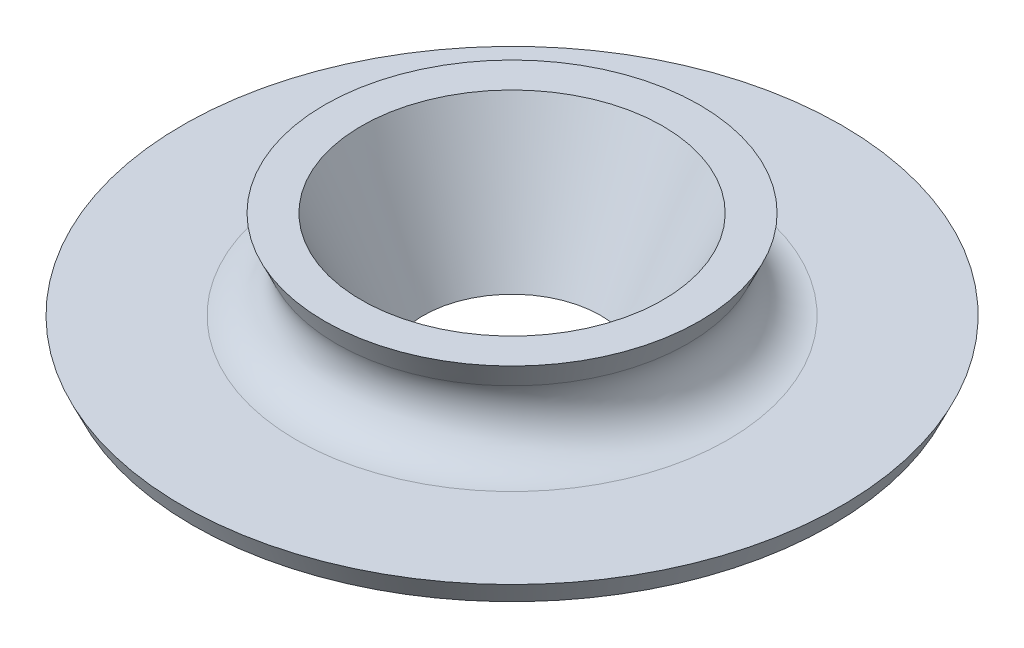
ISO-10303-21;
HEADER;
FILE_DESCRIPTION(('STEP AP214'),'2;1');
FILE_NAME('part.step','',(''),(''),'','','');
FILE_SCHEMA(('AUTOMOTIVE_DESIGN { 1 0 10303 214 1 1 1 1 }'));
ENDSEC;
DATA;
#1=APPLICATION_CONTEXT('core data for automotive mechanical design processes');
#2=APPLICATION_PROTOCOL_DEFINITION('international standard','automotive_design',2000,#1);
#3=PRODUCT_CONTEXT('',#1,'mechanical');
#4=PRODUCT('Part','Part','',(#3));
#5=PRODUCT_RELATED_PRODUCT_CATEGORY('part','',(#4));
#6=PRODUCT_DEFINITION_FORMATION('','',#4);
#7=PRODUCT_DEFINITION_CONTEXT('part definition',#1,'design');
#8=PRODUCT_DEFINITION('design','',#6,#7);
#9=PRODUCT_DEFINITION_SHAPE('','',#8);
#10=(LENGTH_UNIT() NAMED_UNIT(*) SI_UNIT(.MILLI.,.METRE.));
#11=(NAMED_UNIT(*) PLANE_ANGLE_UNIT() SI_UNIT($,.RADIAN.));
#12=(NAMED_UNIT(*) SI_UNIT($,.STERADIAN.) SOLID_ANGLE_UNIT());
#13=UNCERTAINTY_MEASURE_WITH_UNIT(LENGTH_MEASURE(1.E-05),#10,'distance_accuracy_value','');
#14=(GEOMETRIC_REPRESENTATION_CONTEXT(3) GLOBAL_UNCERTAINTY_ASSIGNED_CONTEXT((#13)) GLOBAL_UNIT_ASSIGNED_CONTEXT((#10,
#11,#12)) REPRESENTATION_CONTEXT('',''));
#15=CARTESIAN_POINT('',(0.,0.,0.));
#16=DIRECTION('',(0.,0.,1.));
#17=DIRECTION('',(1.,0.,0.));
#18=AXIS2_PLACEMENT_3D('',#15,#16,#17);
#19=CARTESIAN_POINT('',(0.,0.342101116260542,0.));
#20=DIRECTION('',(0.,1.,0.));
#21=DIRECTION('',(0.,0.,1.));
#22=AXIS2_PLACEMENT_3D('',#19,#20,#21);
#23=CONICAL_SURFACE('',#22,25.4,0.436332312998577);
#24=CARTESIAN_POINT('',(0.,38.4421011162605,0.));
#25=DIRECTION('',(0.,-1.,0.));
#26=DIRECTION('',(0.,0.,-1.));
#27=AXIS2_PLACEMENT_3D('',#24,#25,#26);
#28=CIRCLE('',#27,43.1663217757052);
#29=CARTESIAN_POINT('',(0.,38.4421011162605,-43.1663217757052));
#30=VERTEX_POINT('',#29);
#31=EDGE_CURVE('E69',#30,#30,#28,.T.);
#32=ORIENTED_EDGE('',*,*,#31,.F.);
#33=EDGE_LOOP('',(#32));
#34=FACE_BOUND('',#33,.T.);
#35=CARTESIAN_POINT('',(0.,0.342101116260542,0.));
#36=DIRECTION('',(0.,-1.,0.));
#37=DIRECTION('',(0.,0.,-1.));
#38=AXIS2_PLACEMENT_3D('',#35,#36,#37);
#39=CIRCLE('',#38,25.4);
#40=CARTESIAN_POINT('',(0.,0.342101116260542,-25.4));
#41=VERTEX_POINT('',#40);
#42=EDGE_CURVE('E48',#41,#41,#39,.T.);
#43=ORIENTED_EDGE('',*,*,#42,.T.);
#44=EDGE_LOOP('',(#43));
#45=FACE_BOUND('',#44,.T.);
#46=ADVANCED_FACE('F37',(#34,#45),#23,.F.);
#47=CARTESIAN_POINT('',(-25.4,0.34210111626054,0.));
#48=DIRECTION('',(0.,1.,0.));
#49=DIRECTION('',(0.,0.,1.));
#50=AXIS2_PLACEMENT_3D('',#47,#48,#49);
#51=PLANE('',#50);
#52=ORIENTED_EDGE('',*,*,#42,.F.);
#53=EDGE_LOOP('',(#52));
#54=FACE_BOUND('',#53,.T.);
#55=CARTESIAN_POINT('',(0.,0.342101116260538,0.));
#56=DIRECTION('',(0.,-1.,0.));
#57=DIRECTION('',(0.,0.,-1.));
#58=AXIS2_PLACEMENT_3D('',#55,#56,#57);
#59=CIRCLE('',#58,32.4064497854118);
#60=CARTESIAN_POINT('',(0.,0.342101116260538,-32.4064497854118));
#61=VERTEX_POINT('',#60);
#62=EDGE_CURVE('E52',#61,#61,#59,.T.);
#63=ORIENTED_EDGE('',*,*,#62,.T.);
#64=EDGE_LOOP('',(#63));
#65=FACE_BOUND('',#64,.T.);
#66=ADVANCED_FACE('F77',(#54,#65),#51,.F.);
#67=CARTESIAN_POINT('',(0.,6.69210111626053,0.));
#68=DIRECTION('',(0.,1.,0.));
#69=DIRECTION('',(0.,0.,1.));
#70=AXIS2_PLACEMENT_3D('',#67,#68,#69);
#71=CONICAL_SURFACE('',#70,35.367503414696,0.436332312998577);
#72=ORIENTED_EDGE('',*,*,#62,.F.);
#73=EDGE_LOOP('',(#72));
#74=FACE_BOUND('',#73,.T.);
#75=CARTESIAN_POINT('',(0.,6.69210111626053,0.));
#76=DIRECTION('',(0.,-1.,0.));
#77=DIRECTION('',(0.,0.,-1.));
#78=AXIS2_PLACEMENT_3D('',#75,#76,#77);
#79=CIRCLE('',#78,35.367503414696);
#80=CARTESIAN_POINT('',(0.,6.69210111626053,-35.367503414696));
#81=VERTEX_POINT('',#80);
#82=EDGE_CURVE('E57',#81,#81,#79,.T.);
#83=ORIENTED_EDGE('',*,*,#82,.T.);
#84=EDGE_LOOP('',(#83));
#85=FACE_BOUND('',#84,.T.);
#86=ADVANCED_FACE('F82',(#74,#85),#71,.T.);
#87=CARTESIAN_POINT('',(-35.367503414696,6.69210111626053,0.));
#88=DIRECTION('',(0.,1.,0.));
#89=DIRECTION('',(0.,0.,1.));
#90=AXIS2_PLACEMENT_3D('',#87,#88,#89);
#91=PLANE('',#90);
#92=ORIENTED_EDGE('',*,*,#82,.F.);
#93=EDGE_LOOP('',(#92));
#94=FACE_BOUND('',#93,.T.);
#95=CARTESIAN_POINT('',(0.,6.69210111626052,0.));
#96=DIRECTION('',(0.,-1.,0.));
#97=DIRECTION('',(0.,0.,-1.));
#98=AXIS2_PLACEMENT_3D('',#95,#96,#97);
#99=CIRCLE('',#98,91.4191016979904);
#100=CARTESIAN_POINT('',(0.,6.69210111626052,-91.4191016979904));
#101=VERTEX_POINT('',#100);
#102=EDGE_CURVE('E60',#101,#101,#99,.T.);
#103=ORIENTED_EDGE('',*,*,#102,.T.);
#104=EDGE_LOOP('',(#103));
#105=FACE_BOUND('',#104,.T.);
#106=ADVANCED_FACE('F88',(#94,#105),#91,.F.);
#107=CARTESIAN_POINT('',(0.,13.0421011162605,0.));
#108=DIRECTION('',(0.,1.,0.));
#109=DIRECTION('',(0.,0.,1.));
#110=AXIS2_PLACEMENT_3D('',#107,#108,#109);
#111=CONICAL_SURFACE('',#110,94.3801553272746,0.436332312998573);
#112=ORIENTED_EDGE('',*,*,#102,.F.);
#113=EDGE_LOOP('',(#112));
#114=FACE_BOUND('',#113,.T.);
#115=CARTESIAN_POINT('',(0.,13.0421011162605,0.));
#116=DIRECTION('',(0.,-1.,0.));
#117=DIRECTION('',(0.,0.,-1.));
#118=AXIS2_PLACEMENT_3D('',#115,#116,#117);
#119=CIRCLE('',#118,94.3801553272746);
#120=CARTESIAN_POINT('',(0.,13.0421011162605,-94.3801553272746));
#121=VERTEX_POINT('',#120);
#122=EDGE_CURVE('E63',#121,#121,#119,.T.);
#123=ORIENTED_EDGE('',*,*,#122,.T.);
#124=EDGE_LOOP('',(#123));
#125=FACE_BOUND('',#124,.T.);
#126=ADVANCED_FACE('F94',(#114,#125),#111,.T.);
#127=CARTESIAN_POINT('',(-94.3801553272746,13.0421011162605,0.));
#128=DIRECTION('',(0.,-1.,0.));
#129=DIRECTION('',(0.,0.,-1.));
#130=AXIS2_PLACEMENT_3D('',#127,#128,#129);
#131=PLANE('',#130);
#132=CARTESIAN_POINT('',(0.,13.0421011162605,0.));
#133=DIRECTION('',(0.,-1.,0.));
#134=DIRECTION('',(0.,0.,-1.));
#135=AXIS2_PLACEMENT_3D('',#132,#133,#134);
#136=CIRCLE('',#135,61.7667887660781);
#137=CARTESIAN_POINT('',(0.,13.0421011162605,-61.7667887660781));
#138=VERTEX_POINT('',#137);
#139=EDGE_CURVE('E44',#138,#138,#136,.T.);
#140=ORIENTED_EDGE('',*,*,#139,.T.);
#141=EDGE_LOOP('',(#140));
#142=FACE_BOUND('',#141,.T.);
#143=ORIENTED_EDGE('',*,*,#122,.F.);
#144=EDGE_LOOP('',(#143));
#145=FACE_BOUND('',#144,.T.);
#146=ADVANCED_FACE('F100',(#142,#145),#131,.F.);
#147=CARTESIAN_POINT('',(0.,38.4421011162605,0.));
#148=DIRECTION('',(0.,1.,0.));
#149=DIRECTION('',(0.,0.,1.));
#150=AXIS2_PLACEMENT_3D('',#147,#148,#149);
#151=CONICAL_SURFACE('',#150,53.6759964538229,0.436332312998577);
#152=CARTESIAN_POINT('',(0.,31.1093530403674,0.));
#153=DIRECTION('',(0.,1.,0.));
#154=DIRECTION('',(0.,0.,1.));
#155=AXIS2_PLACEMENT_3D('',#152,#153,#154);
#156=CIRCLE('',#155,50.2566798707126);
#157=CARTESIAN_POINT('',(0.,31.1093530403674,50.2566798707126));
#158=VERTEX_POINT('',#157);
#159=EDGE_CURVE('E10',#158,#158,#156,.T.);
#160=ORIENTED_EDGE('',*,*,#159,.T.);
#161=EDGE_LOOP('',(#160));
#162=FACE_BOUND('',#161,.T.);
#163=CARTESIAN_POINT('',(0.,38.4421011162605,0.));
#164=DIRECTION('',(0.,-1.,0.));
#165=DIRECTION('',(0.,0.,-1.));
#166=AXIS2_PLACEMENT_3D('',#163,#164,#165);
#167=CIRCLE('',#166,53.6759964538229);
#168=CARTESIAN_POINT('',(0.,38.4421011162605,-53.6759964538229));
#169=VERTEX_POINT('',#168);
#170=EDGE_CURVE('E66',#169,#169,#167,.T.);
#171=ORIENTED_EDGE('',*,*,#170,.T.);
#172=EDGE_LOOP('',(#171));
#173=FACE_BOUND('',#172,.T.);
#174=ADVANCED_FACE('F105',(#162,#173),#151,.T.);
#175=CARTESIAN_POINT('',(-53.6759964538229,38.4421011162605,0.));
#176=DIRECTION('',(0.,-1.,0.));
#177=DIRECTION('',(0.,0.,-1.));
#178=AXIS2_PLACEMENT_3D('',#175,#176,#177);
#179=PLANE('',#178);
#180=ORIENTED_EDGE('',*,*,#170,.F.);
#181=EDGE_LOOP('',(#180));
#182=FACE_BOUND('',#181,.T.);
#183=ORIENTED_EDGE('',*,*,#31,.T.);
#184=EDGE_LOOP('',(#183));
#185=FACE_BOUND('',#184,.T.);
#186=ADVANCED_FACE('F73',(#182,#185),#179,.F.);
#187=CARTESIAN_POINT('',(0.,25.7421011162605,0.));
#188=DIRECTION('',(0.,-1.,0.));
#189=DIRECTION('',(0.,0.,-1.));
#190=AXIS2_PLACEMENT_3D('',#187,#188,#189);
#191=TOROIDAL_SURFACE('',#190,61.7667887660781,12.7);
#192=ORIENTED_EDGE('',*,*,#159,.F.);
#193=EDGE_LOOP('',(#192));
#194=FACE_BOUND('',#193,.T.);
#195=ORIENTED_EDGE('',*,*,#139,.F.);
#196=EDGE_LOOP('',(#195));
#197=FACE_BOUND('',#196,.T.);
#198=ADVANCED_FACE('F39',(#194,#197),#191,.F.);
#199=CLOSED_SHELL('',(#46,#66,#86,#106,#126,#146,#174,#186,#198));
#200=MANIFOLD_SOLID_BREP('B2',#199);
#201=ADVANCED_BREP_SHAPE_REPRESENTATION('',(#18,#200),#14);
#202=SHAPE_DEFINITION_REPRESENTATION(#9,#201);
ENDSEC;
END-ISO-10303-21;
